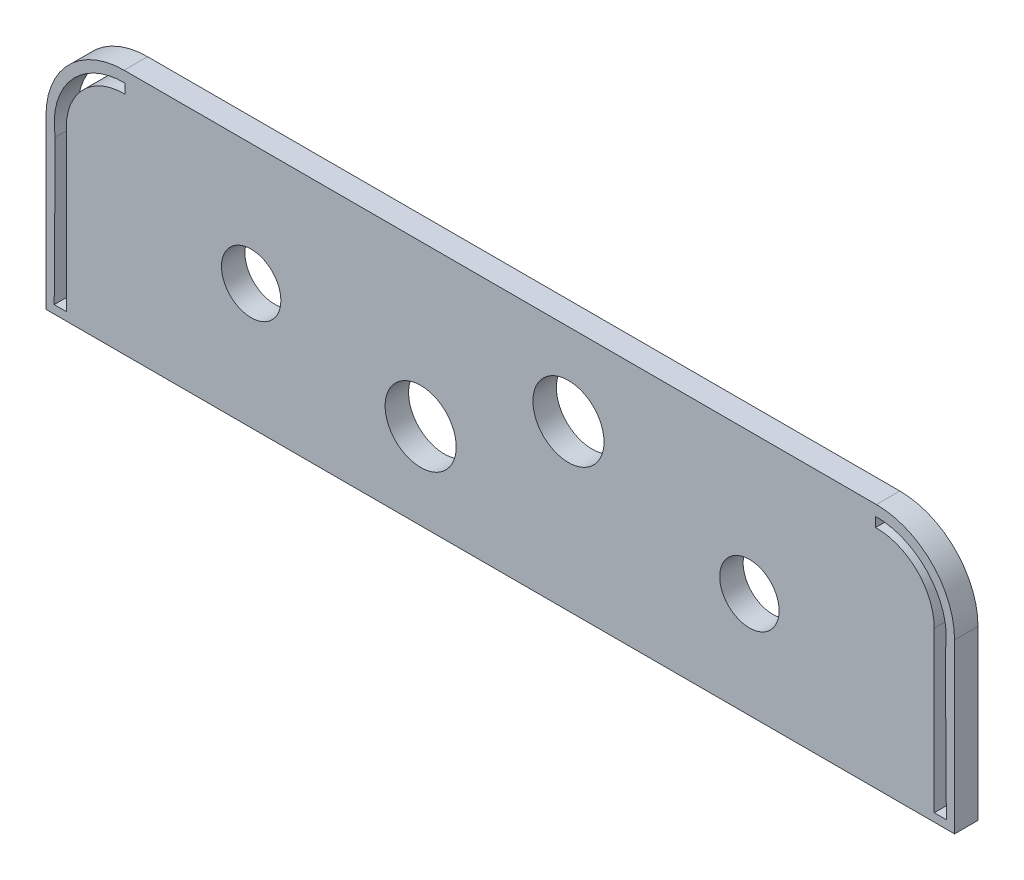
ISO-10303-21;
HEADER;
FILE_DESCRIPTION(('STEP AP214'),'2;1');
FILE_NAME('part.step','',(''),(''),'','','');
FILE_SCHEMA(('AUTOMOTIVE_DESIGN { 1 0 10303 214 1 1 1 1 }'));
ENDSEC;
DATA;
#1=APPLICATION_CONTEXT('core data for automotive mechanical design processes');
#2=APPLICATION_PROTOCOL_DEFINITION('international standard','automotive_design',2000,#1);
#3=PRODUCT_CONTEXT('',#1,'mechanical');
#4=PRODUCT('Part','Part','',(#3));
#5=PRODUCT_RELATED_PRODUCT_CATEGORY('part','',(#4));
#6=PRODUCT_DEFINITION_FORMATION('','',#4);
#7=PRODUCT_DEFINITION_CONTEXT('part definition',#1,'design');
#8=PRODUCT_DEFINITION('design','',#6,#7);
#9=PRODUCT_DEFINITION_SHAPE('','',#8);
#10=(LENGTH_UNIT() NAMED_UNIT(*) SI_UNIT(.MILLI.,.METRE.));
#11=(NAMED_UNIT(*) PLANE_ANGLE_UNIT() SI_UNIT($,.RADIAN.));
#12=(NAMED_UNIT(*) SI_UNIT($,.STERADIAN.) SOLID_ANGLE_UNIT());
#13=UNCERTAINTY_MEASURE_WITH_UNIT(LENGTH_MEASURE(1.E-05),#10,'distance_accuracy_value','');
#14=(GEOMETRIC_REPRESENTATION_CONTEXT(3) GLOBAL_UNCERTAINTY_ASSIGNED_CONTEXT((#13)) GLOBAL_UNIT_ASSIGNED_CONTEXT((#10,
#11,#12)) REPRESENTATION_CONTEXT('',''));
#15=CARTESIAN_POINT('',(0.,0.,0.));
#16=DIRECTION('',(0.,0.,1.));
#17=DIRECTION('',(1.,0.,0.));
#18=AXIS2_PLACEMENT_3D('',#15,#16,#17);
#19=CARTESIAN_POINT('',(58.125,5.75,3.));
#20=DIRECTION('',(-1.,0.,0.));
#21=DIRECTION('',(0.,-1.,0.));
#22=AXIS2_PLACEMENT_3D('',#19,#20,#21);
#23=PLANE('',#22);
#24=DIRECTION('',(0.,-1.,0.));
#25=VECTOR('',#24,1.);
#26=CARTESIAN_POINT('',(58.125,-15.75,3.));
#27=LINE('',#26,#25);
#28=CARTESIAN_POINT('',(58.125,5.74999999999999,3.));
#29=VERTEX_POINT('',#28);
#30=CARTESIAN_POINT('',(58.125,-15.75,3.));
#31=VERTEX_POINT('',#30);
#32=EDGE_CURVE('E367',#29,#31,#27,.T.);
#33=ORIENTED_EDGE('',*,*,#32,.T.);
#34=DIRECTION('',(0.,0.,-1.));
#35=VECTOR('',#34,1.);
#36=CARTESIAN_POINT('',(58.125,-15.75,3.));
#37=LINE('',#36,#35);
#38=CARTESIAN_POINT('',(58.125,-15.75,0.));
#39=VERTEX_POINT('',#38);
#40=EDGE_CURVE('E267',#31,#39,#37,.T.);
#41=ORIENTED_EDGE('',*,*,#40,.T.);
#42=DIRECTION('',(0.,1.,0.));
#43=VECTOR('',#42,1.);
#44=CARTESIAN_POINT('',(58.125,5.75,0.));
#45=LINE('',#44,#43);
#46=CARTESIAN_POINT('',(58.125,5.75,0.));
#47=VERTEX_POINT('',#46);
#48=EDGE_CURVE('E258',#39,#47,#45,.T.);
#49=ORIENTED_EDGE('',*,*,#48,.T.);
#50=DIRECTION('',(0.,0.,-1.));
#51=VECTOR('',#50,1.);
#52=CARTESIAN_POINT('',(58.125,5.75,3.));
#53=LINE('',#52,#51);
#54=EDGE_CURVE('E293',#29,#47,#53,.T.);
#55=ORIENTED_EDGE('',*,*,#54,.F.);
#56=EDGE_LOOP('',(#33,#41,#49,#55));
#57=FACE_BOUND('',#56,.T.);
#58=ADVANCED_FACE('F43',(#57),#23,.F.);
#59=CARTESIAN_POINT('',(48.125,5.75,3.));
#60=DIRECTION('',(0.,0.,-1.));
#61=DIRECTION('',(-1.,0.,0.));
#62=AXIS2_PLACEMENT_3D('',#59,#60,#61);
#63=CYLINDRICAL_SURFACE('',#62,10.);
#64=CARTESIAN_POINT('',(48.125,5.75,3.));
#65=DIRECTION('',(0.,0.,1.));
#66=DIRECTION('',(1.,0.,0.));
#67=AXIS2_PLACEMENT_3D('',#64,#65,#66);
#68=CIRCLE('',#67,10.);
#69=CARTESIAN_POINT('',(48.125,15.75,3.));
#70=VERTEX_POINT('',#69);
#71=EDGE_CURVE('E189',#70,#29,#68,.F.);
#72=ORIENTED_EDGE('',*,*,#71,.T.);
#73=ORIENTED_EDGE('',*,*,#54,.T.);
#74=CARTESIAN_POINT('',(48.125,5.75,0.));
#75=DIRECTION('',(0.,0.,1.));
#76=DIRECTION('',(-1.,0.,0.));
#77=AXIS2_PLACEMENT_3D('',#74,#75,#76);
#78=CIRCLE('',#77,10.);
#79=CARTESIAN_POINT('',(48.125,15.75,0.));
#80=VERTEX_POINT('',#79);
#81=EDGE_CURVE('E270',#47,#80,#78,.T.);
#82=ORIENTED_EDGE('',*,*,#81,.T.);
#83=DIRECTION('',(0.,0.,-1.));
#84=VECTOR('',#83,1.);
#85=CARTESIAN_POINT('',(48.125,15.75,3.));
#86=LINE('',#85,#84);
#87=EDGE_CURVE('E290',#70,#80,#86,.T.);
#88=ORIENTED_EDGE('',*,*,#87,.F.);
#89=EDGE_LOOP('',(#72,#73,#82,#88));
#90=FACE_BOUND('',#89,.T.);
#91=ADVANCED_FACE('F357',(#90),#63,.T.);
#92=CARTESIAN_POINT('',(-48.125,5.75,3.));
#93=DIRECTION('',(0.,0.,-1.));
#94=DIRECTION('',(-1.,0.,0.));
#95=AXIS2_PLACEMENT_3D('',#92,#93,#94);
#96=CYLINDRICAL_SURFACE('',#95,10.);
#97=CARTESIAN_POINT('',(-48.125,5.75,3.));
#98=DIRECTION('',(0.,0.,1.));
#99=DIRECTION('',(1.,0.,0.));
#100=AXIS2_PLACEMENT_3D('',#97,#98,#99);
#101=CIRCLE('',#100,10.);
#102=CARTESIAN_POINT('',(-58.125,5.75,3.));
#103=VERTEX_POINT('',#102);
#104=CARTESIAN_POINT('',(-48.125,15.75,3.));
#105=VERTEX_POINT('',#104);
#106=EDGE_CURVE('E319',#103,#105,#101,.F.);
#107=ORIENTED_EDGE('',*,*,#106,.T.);
#108=DIRECTION('',(0.,0.,-1.));
#109=VECTOR('',#108,1.);
#110=CARTESIAN_POINT('',(-48.125,15.75,3.));
#111=LINE('',#110,#109);
#112=CARTESIAN_POINT('',(-48.125,15.75,0.));
#113=VERTEX_POINT('',#112);
#114=EDGE_CURVE('E287',#105,#113,#111,.T.);
#115=ORIENTED_EDGE('',*,*,#114,.T.);
#116=CARTESIAN_POINT('',(-48.125,5.75,0.));
#117=DIRECTION('',(0.,0.,1.));
#118=DIRECTION('',(1.,0.,0.));
#119=AXIS2_PLACEMENT_3D('',#116,#117,#118);
#120=CIRCLE('',#119,10.);
#121=CARTESIAN_POINT('',(-58.125,5.75,0.));
#122=VERTEX_POINT('',#121);
#123=EDGE_CURVE('E274',#113,#122,#120,.T.);
#124=ORIENTED_EDGE('',*,*,#123,.T.);
#125=DIRECTION('',(0.,0.,-1.));
#126=VECTOR('',#125,1.);
#127=CARTESIAN_POINT('',(-58.125,5.75,3.));
#128=LINE('',#127,#126);
#129=EDGE_CURVE('E285',#103,#122,#128,.T.);
#130=ORIENTED_EDGE('',*,*,#129,.F.);
#131=EDGE_LOOP('',(#107,#115,#124,#130));
#132=FACE_BOUND('',#131,.T.);
#133=ADVANCED_FACE('F363',(#132),#96,.T.);
#134=CARTESIAN_POINT('',(-58.125,5.75,3.));
#135=DIRECTION('',(1.,0.,0.));
#136=DIRECTION('',(0.,0.,-1.));
#137=AXIS2_PLACEMENT_3D('',#134,#135,#136);
#138=PLANE('',#137);
#139=DIRECTION('',(0.,1.,0.));
#140=VECTOR('',#139,1.);
#141=CARTESIAN_POINT('',(-58.125,5.75,3.));
#142=LINE('',#141,#140);
#143=CARTESIAN_POINT('',(-58.125,-15.75,3.));
#144=VERTEX_POINT('',#143);
#145=EDGE_CURVE('E393',#144,#103,#142,.T.);
#146=ORIENTED_EDGE('',*,*,#145,.T.);
#147=ORIENTED_EDGE('',*,*,#129,.T.);
#148=DIRECTION('',(0.,-1.,0.));
#149=VECTOR('',#148,1.);
#150=CARTESIAN_POINT('',(-58.125,5.75,0.));
#151=LINE('',#150,#149);
#152=CARTESIAN_POINT('',(-58.125,-15.75,0.));
#153=VERTEX_POINT('',#152);
#154=EDGE_CURVE('E277',#122,#153,#151,.T.);
#155=ORIENTED_EDGE('',*,*,#154,.T.);
#156=DIRECTION('',(0.,0.,-1.));
#157=VECTOR('',#156,1.);
#158=CARTESIAN_POINT('',(-58.125,-15.75,3.));
#159=LINE('',#158,#157);
#160=EDGE_CURVE('E283',#144,#153,#159,.T.);
#161=ORIENTED_EDGE('',*,*,#160,.F.);
#162=EDGE_LOOP('',(#146,#147,#155,#161));
#163=FACE_BOUND('',#162,.T.);
#164=ADVANCED_FACE('F397',(#163),#138,.F.);
#165=CARTESIAN_POINT('',(-58.125,-15.75,3.));
#166=DIRECTION('',(0.,1.,0.));
#167=DIRECTION('',(0.,0.,1.));
#168=AXIS2_PLACEMENT_3D('',#165,#166,#167);
#169=PLANE('',#168);
#170=ORIENTED_EDGE('',*,*,#40,.F.);
#171=DIRECTION('',(1.,0.,0.));
#172=VECTOR('',#171,1.);
#173=CARTESIAN_POINT('',(-58.125,-15.75,3.));
#174=LINE('',#173,#172);
#175=EDGE_CURVE('E264',#144,#31,#174,.T.);
#176=ORIENTED_EDGE('',*,*,#175,.F.);
#177=ORIENTED_EDGE('',*,*,#160,.T.);
#178=DIRECTION('',(1.,0.,0.));
#179=VECTOR('',#178,1.);
#180=CARTESIAN_POINT('',(-58.125,-15.75,0.));
#181=LINE('',#180,#179);
#182=EDGE_CURVE('E265',#153,#39,#181,.T.);
#183=ORIENTED_EDGE('',*,*,#182,.T.);
#184=EDGE_LOOP('',(#170,#176,#177,#183));
#185=FACE_BOUND('',#184,.T.);
#186=ADVANCED_FACE('F372',(#185),#169,.F.);
#187=CARTESIAN_POINT('',(-48.125,5.4351898188413,-22.));
#188=DIRECTION('',(0.,0.,1.));
#189=DIRECTION('',(1.,0.,0.));
#190=AXIS2_PLACEMENT_3D('',#187,#188,#189);
#191=CYLINDRICAL_SURFACE('',#190,8.95);
#192=CARTESIAN_POINT('',(-48.125,5.4351898188413,3.));
#193=DIRECTION('',(0.,0.,1.));
#194=DIRECTION('',(1.,0.,0.));
#195=AXIS2_PLACEMENT_3D('',#192,#193,#194);
#196=CIRCLE('',#195,8.95);
#197=CARTESIAN_POINT('',(-48.025,14.3846311421866,3.));
#198=VERTEX_POINT('',#197);
#199=CARTESIAN_POINT('',(-56.946937757455,3.92657648084162,3.));
#200=VERTEX_POINT('',#199);
#201=EDGE_CURVE('E226',#198,#200,#196,.T.);
#202=ORIENTED_EDGE('',*,*,#201,.T.);
#203=DIRECTION('',(0.,0.,1.));
#204=VECTOR('',#203,1.);
#205=CARTESIAN_POINT('',(-56.946937757455,3.92657648084162,-22.));
#206=LINE('',#205,#204);
#207=CARTESIAN_POINT('',(-56.946937757455,3.92657648084162,0.));
#208=VERTEX_POINT('',#207);
#209=EDGE_CURVE('E195',#208,#200,#206,.T.);
#210=ORIENTED_EDGE('',*,*,#209,.F.);
#211=CARTESIAN_POINT('',(-48.125,5.4351898188413,0.));
#212=DIRECTION('',(0.,0.,1.));
#213=DIRECTION('',(1.,0.,0.));
#214=AXIS2_PLACEMENT_3D('',#211,#212,#213);
#215=CIRCLE('',#214,8.95);
#216=CARTESIAN_POINT('',(-48.025,14.3846311421866,0.));
#217=VERTEX_POINT('',#216);
#218=EDGE_CURVE('E228',#217,#208,#215,.T.);
#219=ORIENTED_EDGE('',*,*,#218,.F.);
#220=DIRECTION('',(0.,0.,1.));
#221=VECTOR('',#220,1.);
#222=CARTESIAN_POINT('',(-48.025,14.3846311421866,-22.));
#223=LINE('',#222,#221);
#224=EDGE_CURVE('E215',#217,#198,#223,.T.);
#225=ORIENTED_EDGE('',*,*,#224,.T.);
#226=EDGE_LOOP('',(#202,#210,#219,#225));
#227=FACE_BOUND('',#226,.T.);
#228=ADVANCED_FACE('F404',(#227),#191,.F.);
#229=CARTESIAN_POINT('',(-55.525,-14.7,-22.));
#230=DIRECTION('',(0.,-1.,0.));
#231=DIRECTION('',(0.,0.,-1.));
#232=AXIS2_PLACEMENT_3D('',#229,#230,#231);
#233=PLANE('',#232);
#234=DIRECTION('',(0.,0.,1.));
#235=VECTOR('',#234,1.);
#236=CARTESIAN_POINT('',(-57.0756936373201,-14.7,-22.));
#237=LINE('',#236,#235);
#238=CARTESIAN_POINT('',(-57.0756936373201,-14.7,0.));
#239=VERTEX_POINT('',#238);
#240=CARTESIAN_POINT('',(-57.0756936373201,-14.7,3.));
#241=VERTEX_POINT('',#240);
#242=EDGE_CURVE('E200',#239,#241,#237,.T.);
#243=ORIENTED_EDGE('',*,*,#242,.T.);
#244=DIRECTION('',(1.,0.,0.));
#245=VECTOR('',#244,1.);
#246=CARTESIAN_POINT('',(-48.125,-14.7,3.));
#247=LINE('',#246,#245);
#248=CARTESIAN_POINT('',(-55.525,-14.7,3.));
#249=VERTEX_POINT('',#248);
#250=EDGE_CURVE('E59',#241,#249,#247,.T.);
#251=ORIENTED_EDGE('',*,*,#250,.T.);
#252=DIRECTION('',(0.,0.,1.));
#253=VECTOR('',#252,1.);
#254=CARTESIAN_POINT('',(-55.525,-14.7,-22.));
#255=LINE('',#254,#253);
#256=CARTESIAN_POINT('',(-55.525,-14.7,0.));
#257=VERTEX_POINT('',#256);
#258=EDGE_CURVE('E206',#257,#249,#255,.T.);
#259=ORIENTED_EDGE('',*,*,#258,.F.);
#260=DIRECTION('',(1.,0.,0.));
#261=VECTOR('',#260,1.);
#262=CARTESIAN_POINT('',(-48.125,-14.7,0.));
#263=LINE('',#262,#261);
#264=EDGE_CURVE('E223',#239,#257,#263,.T.);
#265=ORIENTED_EDGE('',*,*,#264,.F.);
#266=EDGE_LOOP('',(#243,#251,#259,#265));
#267=FACE_BOUND('',#266,.T.);
#268=ADVANCED_FACE('F441',(#267),#233,.F.);
#269=CARTESIAN_POINT('',(-56.946937757455,3.92657648084162,-22.));
#270=DIRECTION('',(-0.999976109650513,0.00691231713860811,0.));
#271=DIRECTION('',(-0.00691231713860811,-0.999976109650513,0.));
#272=AXIS2_PLACEMENT_3D('',#269,#270,#271);
#273=PLANE('',#272);
#274=DIRECTION('',(-0.00691231713860811,-0.999976109650513,0.));
#275=VECTOR('',#274,1.);
#276=CARTESIAN_POINT('',(-57.0756936373201,-14.7,3.));
#277=LINE('',#276,#275);
#278=EDGE_CURVE('E392',#200,#241,#277,.T.);
#279=ORIENTED_EDGE('',*,*,#278,.T.);
#280=ORIENTED_EDGE('',*,*,#242,.F.);
#281=DIRECTION('',(-0.00691231713860811,-0.999976109650513,0.));
#282=VECTOR('',#281,1.);
#283=CARTESIAN_POINT('',(-56.9339124636112,5.81089145131277,0.));
#284=LINE('',#283,#282);
#285=EDGE_CURVE('E219',#208,#239,#284,.T.);
#286=ORIENTED_EDGE('',*,*,#285,.F.);
#287=ORIENTED_EDGE('',*,*,#209,.T.);
#288=EDGE_LOOP('',(#279,#280,#286,#287));
#289=FACE_BOUND('',#288,.T.);
#290=ADVANCED_FACE('F353',(#289),#273,.F.);
#291=CARTESIAN_POINT('',(55.525,-14.7,-22.));
#292=DIRECTION('',(0.,-1.,0.));
#293=DIRECTION('',(0.,0.,-1.));
#294=AXIS2_PLACEMENT_3D('',#291,#292,#293);
#295=PLANE('',#294);
#296=DIRECTION('',(1.,0.,0.));
#297=VECTOR('',#296,1.);
#298=CARTESIAN_POINT('',(-48.125,-14.7,3.));
#299=LINE('',#298,#297);
#300=CARTESIAN_POINT('',(55.525,-14.7,3.));
#301=VERTEX_POINT('',#300);
#302=CARTESIAN_POINT('',(57.0756936373201,-14.7,3.));
#303=VERTEX_POINT('',#302);
#304=EDGE_CURVE('E172',#301,#303,#299,.T.);
#305=ORIENTED_EDGE('',*,*,#304,.T.);
#306=DIRECTION('',(0.,0.,1.));
#307=VECTOR('',#306,1.);
#308=CARTESIAN_POINT('',(57.0756936373201,-14.7,-22.));
#309=LINE('',#308,#307);
#310=CARTESIAN_POINT('',(57.0756936373201,-14.7,0.));
#311=VERTEX_POINT('',#310);
#312=EDGE_CURVE('E175',#311,#303,#309,.T.);
#313=ORIENTED_EDGE('',*,*,#312,.F.);
#314=DIRECTION('',(1.,0.,0.));
#315=VECTOR('',#314,1.);
#316=CARTESIAN_POINT('',(-48.125,-14.7,0.));
#317=LINE('',#316,#315);
#318=CARTESIAN_POINT('',(55.525,-14.7,0.));
#319=VERTEX_POINT('',#318);
#320=EDGE_CURVE('E180',#319,#311,#317,.T.);
#321=ORIENTED_EDGE('',*,*,#320,.F.);
#322=DIRECTION('',(0.,0.,1.));
#323=VECTOR('',#322,1.);
#324=CARTESIAN_POINT('',(55.525,-14.7,-22.));
#325=LINE('',#324,#323);
#326=EDGE_CURVE('E178',#319,#301,#325,.T.);
#327=ORIENTED_EDGE('',*,*,#326,.T.);
#328=EDGE_LOOP('',(#305,#313,#321,#327));
#329=FACE_BOUND('',#328,.T.);
#330=ADVANCED_FACE('F173',(#329),#295,.F.);
#331=CARTESIAN_POINT('',(48.125,5.43518981884131,-22.));
#332=DIRECTION('',(0.,0.,1.));
#333=DIRECTION('',(1.,0.,0.));
#334=AXIS2_PLACEMENT_3D('',#331,#332,#333);
#335=CYLINDRICAL_SURFACE('',#334,8.95);
#336=DIRECTION('',(0.,0.,1.));
#337=VECTOR('',#336,1.);
#338=CARTESIAN_POINT('',(56.946937757455,3.92657648084163,-22.));
#339=LINE('',#338,#337);
#340=CARTESIAN_POINT('',(56.946937757455,3.92657648084163,0.));
#341=VERTEX_POINT('',#340);
#342=CARTESIAN_POINT('',(56.946937757455,3.92657648084163,3.));
#343=VERTEX_POINT('',#342);
#344=EDGE_CURVE('E194',#341,#343,#339,.T.);
#345=ORIENTED_EDGE('',*,*,#344,.T.);
#346=CARTESIAN_POINT('',(48.125,5.43518981884131,3.));
#347=DIRECTION('',(0.,0.,1.));
#348=DIRECTION('',(1.,0.,0.));
#349=AXIS2_PLACEMENT_3D('',#346,#347,#348);
#350=CIRCLE('',#349,8.95);
#351=CARTESIAN_POINT('',(48.025,14.3846311421866,3.));
#352=VERTEX_POINT('',#351);
#353=EDGE_CURVE('E67',#343,#352,#350,.T.);
#354=ORIENTED_EDGE('',*,*,#353,.T.);
#355=DIRECTION('',(0.,0.,1.));
#356=VECTOR('',#355,1.);
#357=CARTESIAN_POINT('',(48.025,14.3846311421866,-22.));
#358=LINE('',#357,#356);
#359=CARTESIAN_POINT('',(48.025,14.3846311421866,0.));
#360=VERTEX_POINT('',#359);
#361=EDGE_CURVE('E197',#360,#352,#358,.T.);
#362=ORIENTED_EDGE('',*,*,#361,.F.);
#363=CARTESIAN_POINT('',(48.125,5.43518981884131,0.));
#364=DIRECTION('',(0.,0.,1.));
#365=DIRECTION('',(1.,0.,0.));
#366=AXIS2_PLACEMENT_3D('',#363,#364,#365);
#367=CIRCLE('',#366,8.95);
#368=EDGE_CURVE('E181',#341,#360,#367,.T.);
#369=ORIENTED_EDGE('',*,*,#368,.F.);
#370=EDGE_LOOP('',(#345,#354,#362,#369));
#371=FACE_BOUND('',#370,.T.);
#372=ADVANCED_FACE('F345',(#371),#335,.F.);
#373=CARTESIAN_POINT('',(56.946937757455,3.92657648084163,-22.));
#374=DIRECTION('',(0.999976109650513,0.00691231713860886,0.));
#375=DIRECTION('',(-0.00691231713860886,0.999976109650513,0.));
#376=AXIS2_PLACEMENT_3D('',#373,#374,#375);
#377=PLANE('',#376);
#378=DIRECTION('',(-0.00691231713860923,0.999976109650513,0.));
#379=VECTOR('',#378,1.);
#380=CARTESIAN_POINT('',(56.946937757455,3.92657648084163,3.));
#381=LINE('',#380,#379);
#382=EDGE_CURVE('E183',#303,#343,#381,.T.);
#383=ORIENTED_EDGE('',*,*,#382,.T.);
#384=ORIENTED_EDGE('',*,*,#344,.F.);
#385=DIRECTION('',(-0.00691231713860886,0.999976109650513,0.));
#386=VECTOR('',#385,1.);
#387=CARTESIAN_POINT('',(56.9293136262696,6.47618608140293,0.));
#388=LINE('',#387,#386);
#389=EDGE_CURVE('E193',#311,#341,#388,.T.);
#390=ORIENTED_EDGE('',*,*,#389,.F.);
#391=ORIENTED_EDGE('',*,*,#312,.T.);
#392=EDGE_LOOP('',(#383,#384,#390,#391));
#393=FACE_BOUND('',#392,.T.);
#394=ADVANCED_FACE('F191',(#393),#377,.F.);
#395=CARTESIAN_POINT('',(-48.125,5.75,3.));
#396=DIRECTION('',(0.,0.,1.));
#397=DIRECTION('',(1.,0.,0.));
#398=AXIS2_PLACEMENT_3D('',#395,#396,#397);
#399=PLANE('',#398);
#400=ORIENTED_EDGE('',*,*,#382,.F.);
#401=ORIENTED_EDGE('',*,*,#304,.F.);
#402=DIRECTION('',(0.,-1.,0.));
#403=VECTOR('',#402,1.);
#404=CARTESIAN_POINT('',(55.525,5.75,3.));
#405=LINE('',#404,#403);
#406=CARTESIAN_POINT('',(55.525,5.75000000000001,3.));
#407=VERTEX_POINT('',#406);
#408=EDGE_CURVE('E246',#407,#301,#405,.T.);
#409=ORIENTED_EDGE('',*,*,#408,.F.);
#410=CARTESIAN_POINT('',(48.125,5.75000000000001,3.));
#411=DIRECTION('',(0.,0.,1.));
#412=DIRECTION('',(1.,0.,0.));
#413=AXIS2_PLACEMENT_3D('',#410,#411,#412);
#414=CIRCLE('',#413,7.40000000000001);
#415=CARTESIAN_POINT('',(48.025,13.1493242934744,3.));
#416=VERTEX_POINT('',#415);
#417=EDGE_CURVE('E244',#416,#407,#414,.F.);
#418=ORIENTED_EDGE('',*,*,#417,.F.);
#419=DIRECTION('',(0.,-1.,0.));
#420=VECTOR('',#419,1.);
#421=CARTESIAN_POINT('',(48.025,5.75,3.));
#422=LINE('',#421,#420);
#423=EDGE_CURVE('E242',#352,#416,#422,.T.);
#424=ORIENTED_EDGE('',*,*,#423,.F.);
#425=ORIENTED_EDGE('',*,*,#353,.F.);
#426=EDGE_LOOP('',(#400,#401,#409,#418,#424,#425));
#427=FACE_BOUND('',#426,.T.);
#428=DIRECTION('',(-1.,0.,0.));
#429=VECTOR('',#428,1.);
#430=CARTESIAN_POINT('',(-48.125,15.75,3.));
#431=LINE('',#430,#429);
#432=EDGE_CURVE('E261',#70,#105,#431,.T.);
#433=ORIENTED_EDGE('',*,*,#432,.T.);
#434=ORIENTED_EDGE('',*,*,#106,.F.);
#435=ORIENTED_EDGE('',*,*,#145,.F.);
#436=ORIENTED_EDGE('',*,*,#175,.T.);
#437=ORIENTED_EDGE('',*,*,#32,.F.);
#438=ORIENTED_EDGE('',*,*,#71,.F.);
#439=EDGE_LOOP('',(#433,#434,#435,#436,#437,#438));
#440=FACE_BOUND('',#439,.T.);
#441=CARTESIAN_POINT('',(-10.185,-4.75,3.));
#442=DIRECTION('',(0.,0.,1.));
#443=DIRECTION('',(1.,0.,0.));
#444=AXIS2_PLACEMENT_3D('',#441,#442,#443);
#445=CIRCLE('',#444,4.55);
#446=CARTESIAN_POINT('',(-5.635,-4.75,3.));
#447=VERTEX_POINT('',#446);
#448=EDGE_CURVE('E218',#447,#447,#445,.T.);
#449=ORIENTED_EDGE('',*,*,#448,.F.);
#450=EDGE_LOOP('',(#449));
#451=FACE_BOUND('',#450,.T.);
#452=CARTESIAN_POINT('',(8.72499999999998,5.25,3.));
#453=DIRECTION('',(0.,0.,1.));
#454=DIRECTION('',(1.,0.,0.));
#455=AXIS2_PLACEMENT_3D('',#452,#453,#454);
#456=CIRCLE('',#455,4.54999999999999);
#457=CARTESIAN_POINT('',(13.275,5.25,3.));
#458=VERTEX_POINT('',#457);
#459=EDGE_CURVE('E309',#458,#458,#456,.T.);
#460=ORIENTED_EDGE('',*,*,#459,.F.);
#461=EDGE_LOOP('',(#460));
#462=FACE_BOUND('',#461,.T.);
#463=ORIENTED_EDGE('',*,*,#278,.F.);
#464=ORIENTED_EDGE('',*,*,#201,.F.);
#465=DIRECTION('',(0.,1.,0.));
#466=VECTOR('',#465,1.);
#467=CARTESIAN_POINT('',(-48.025,5.75,3.));
#468=LINE('',#467,#466);
#469=CARTESIAN_POINT('',(-48.025,13.1493242934744,3.));
#470=VERTEX_POINT('',#469);
#471=EDGE_CURVE('E240',#470,#198,#468,.T.);
#472=ORIENTED_EDGE('',*,*,#471,.F.);
#473=CARTESIAN_POINT('',(-48.125,5.75,3.));
#474=DIRECTION('',(0.,0.,1.));
#475=DIRECTION('',(1.,0.,0.));
#476=AXIS2_PLACEMENT_3D('',#473,#474,#475);
#477=CIRCLE('',#476,7.4);
#478=CARTESIAN_POINT('',(-55.525,5.75,3.));
#479=VERTEX_POINT('',#478);
#480=EDGE_CURVE('E238',#479,#470,#477,.F.);
#481=ORIENTED_EDGE('',*,*,#480,.F.);
#482=DIRECTION('',(0.,1.,0.));
#483=VECTOR('',#482,1.);
#484=CARTESIAN_POINT('',(-55.525,5.75,3.));
#485=LINE('',#484,#483);
#486=EDGE_CURVE('E236',#249,#479,#485,.T.);
#487=ORIENTED_EDGE('',*,*,#486,.F.);
#488=ORIENTED_EDGE('',*,*,#250,.F.);
#489=EDGE_LOOP('',(#463,#464,#472,#481,#487,#488));
#490=FACE_BOUND('',#489,.T.);
#491=CARTESIAN_POINT('',(31.875,-2.25,3.));
#492=DIRECTION('',(0.,0.,1.));
#493=DIRECTION('',(1.,0.,0.));
#494=AXIS2_PLACEMENT_3D('',#491,#492,#493);
#495=CIRCLE('',#494,3.8);
#496=CARTESIAN_POINT('',(35.675,-2.25,3.));
#497=VERTEX_POINT('',#496);
#498=EDGE_CURVE('E255',#497,#497,#495,.T.);
#499=ORIENTED_EDGE('',*,*,#498,.F.);
#500=EDGE_LOOP('',(#499));
#501=FACE_BOUND('',#500,.T.);
#502=CARTESIAN_POINT('',(-31.875,0.249999999999998,3.));
#503=DIRECTION('',(0.,0.,1.));
#504=DIRECTION('',(1.,0.,0.));
#505=AXIS2_PLACEMENT_3D('',#502,#503,#504);
#506=CIRCLE('',#505,3.8);
#507=CARTESIAN_POINT('',(-28.075,0.249999999999998,3.));
#508=VERTEX_POINT('',#507);
#509=EDGE_CURVE('E249',#508,#508,#506,.T.);
#510=ORIENTED_EDGE('',*,*,#509,.F.);
#511=EDGE_LOOP('',(#510));
#512=FACE_BOUND('',#511,.T.);
#513=ADVANCED_FACE('F184',(#427,#440,#451,#462,#490,#501,#512),#399,.T.);
#514=CARTESIAN_POINT('',(-48.125,5.75,0.));
#515=DIRECTION('',(0.,0.,1.));
#516=DIRECTION('',(1.,0.,0.));
#517=AXIS2_PLACEMENT_3D('',#514,#515,#516);
#518=PLANE('',#517);
#519=CARTESIAN_POINT('',(-10.185,-4.75,0.));
#520=DIRECTION('',(0.,0.,1.));
#521=DIRECTION('',(1.,0.,0.));
#522=AXIS2_PLACEMENT_3D('',#519,#520,#521);
#523=CIRCLE('',#522,4.55);
#524=CARTESIAN_POINT('',(-5.635,-4.75,0.));
#525=VERTEX_POINT('',#524);
#526=EDGE_CURVE('E46',#525,#525,#523,.T.);
#527=ORIENTED_EDGE('',*,*,#526,.T.);
#528=EDGE_LOOP('',(#527));
#529=FACE_BOUND('',#528,.T.);
#530=CARTESIAN_POINT('',(8.72499999999998,5.25,0.));
#531=DIRECTION('',(0.,0.,1.));
#532=DIRECTION('',(1.,0.,0.));
#533=AXIS2_PLACEMENT_3D('',#530,#531,#532);
#534=CIRCLE('',#533,4.54999999999999);
#535=CARTESIAN_POINT('',(13.275,5.25,0.));
#536=VERTEX_POINT('',#535);
#537=EDGE_CURVE('E188',#536,#536,#534,.T.);
#538=ORIENTED_EDGE('',*,*,#537,.T.);
#539=EDGE_LOOP('',(#538));
#540=FACE_BOUND('',#539,.T.);
#541=DIRECTION('',(0.,-1.,0.));
#542=VECTOR('',#541,1.);
#543=CARTESIAN_POINT('',(55.525,5.75,0.));
#544=LINE('',#543,#542);
#545=CARTESIAN_POINT('',(55.525,5.75000000000001,0.));
#546=VERTEX_POINT('',#545);
#547=EDGE_CURVE('E11',#546,#319,#544,.T.);
#548=ORIENTED_EDGE('',*,*,#547,.T.);
#549=ORIENTED_EDGE('',*,*,#320,.T.);
#550=ORIENTED_EDGE('',*,*,#389,.T.);
#551=ORIENTED_EDGE('',*,*,#368,.T.);
#552=DIRECTION('',(0.,-1.,0.));
#553=VECTOR('',#552,1.);
#554=CARTESIAN_POINT('',(48.025,5.75,0.));
#555=LINE('',#554,#553);
#556=CARTESIAN_POINT('',(48.025,13.1493242934744,0.));
#557=VERTEX_POINT('',#556);
#558=EDGE_CURVE('E304',#360,#557,#555,.T.);
#559=ORIENTED_EDGE('',*,*,#558,.T.);
#560=CARTESIAN_POINT('',(48.125,5.75000000000001,0.));
#561=DIRECTION('',(0.,0.,1.));
#562=DIRECTION('',(1.,0.,0.));
#563=AXIS2_PLACEMENT_3D('',#560,#561,#562);
#564=CIRCLE('',#563,7.40000000000001);
#565=EDGE_CURVE('E51',#557,#546,#564,.F.);
#566=ORIENTED_EDGE('',*,*,#565,.T.);
#567=EDGE_LOOP('',(#548,#549,#550,#551,#559,#566));
#568=FACE_BOUND('',#567,.T.);
#569=DIRECTION('',(0.,1.,0.));
#570=VECTOR('',#569,1.);
#571=CARTESIAN_POINT('',(-48.025,5.75,0.));
#572=LINE('',#571,#570);
#573=CARTESIAN_POINT('',(-48.025,13.1493242934744,0.));
#574=VERTEX_POINT('',#573);
#575=EDGE_CURVE('E301',#574,#217,#572,.T.);
#576=ORIENTED_EDGE('',*,*,#575,.T.);
#577=ORIENTED_EDGE('',*,*,#218,.T.);
#578=ORIENTED_EDGE('',*,*,#285,.T.);
#579=ORIENTED_EDGE('',*,*,#264,.T.);
#580=DIRECTION('',(0.,1.,0.));
#581=VECTOR('',#580,1.);
#582=CARTESIAN_POINT('',(-55.525,5.75,0.));
#583=LINE('',#582,#581);
#584=CARTESIAN_POINT('',(-55.525,5.75,0.));
#585=VERTEX_POINT('',#584);
#586=EDGE_CURVE('E295',#257,#585,#583,.T.);
#587=ORIENTED_EDGE('',*,*,#586,.T.);
#588=CARTESIAN_POINT('',(-48.125,5.75,0.));
#589=DIRECTION('',(0.,0.,1.));
#590=DIRECTION('',(1.,0.,0.));
#591=AXIS2_PLACEMENT_3D('',#588,#589,#590);
#592=CIRCLE('',#591,7.4);
#593=EDGE_CURVE('E298',#585,#574,#592,.F.);
#594=ORIENTED_EDGE('',*,*,#593,.T.);
#595=EDGE_LOOP('',(#576,#577,#578,#579,#587,#594));
#596=FACE_BOUND('',#595,.T.);
#597=ORIENTED_EDGE('',*,*,#48,.F.);
#598=ORIENTED_EDGE('',*,*,#182,.F.);
#599=ORIENTED_EDGE('',*,*,#154,.F.);
#600=ORIENTED_EDGE('',*,*,#123,.F.);
#601=DIRECTION('',(-1.,0.,0.));
#602=VECTOR('',#601,1.);
#603=CARTESIAN_POINT('',(-48.125,15.75,0.));
#604=LINE('',#603,#602);
#605=EDGE_CURVE('E272',#80,#113,#604,.T.);
#606=ORIENTED_EDGE('',*,*,#605,.F.);
#607=ORIENTED_EDGE('',*,*,#81,.F.);
#608=EDGE_LOOP('',(#597,#598,#599,#600,#606,#607));
#609=FACE_BOUND('',#608,.T.);
#610=CARTESIAN_POINT('',(31.875,-2.25,0.));
#611=DIRECTION('',(0.,0.,1.));
#612=DIRECTION('',(1.,0.,0.));
#613=AXIS2_PLACEMENT_3D('',#610,#611,#612);
#614=CIRCLE('',#613,3.8);
#615=CARTESIAN_POINT('',(35.675,-2.25,0.));
#616=VERTEX_POINT('',#615);
#617=EDGE_CURVE('E252',#616,#616,#614,.T.);
#618=ORIENTED_EDGE('',*,*,#617,.T.);
#619=EDGE_LOOP('',(#618));
#620=FACE_BOUND('',#619,.T.);
#621=CARTESIAN_POINT('',(-31.875,0.249999999999998,0.));
#622=DIRECTION('',(0.,0.,1.));
#623=DIRECTION('',(1.,0.,0.));
#624=AXIS2_PLACEMENT_3D('',#621,#622,#623);
#625=CIRCLE('',#624,3.8);
#626=CARTESIAN_POINT('',(-28.075,0.249999999999998,0.));
#627=VERTEX_POINT('',#626);
#628=EDGE_CURVE('E248',#627,#627,#625,.T.);
#629=ORIENTED_EDGE('',*,*,#628,.T.);
#630=EDGE_LOOP('',(#629));
#631=FACE_BOUND('',#630,.T.);
#632=ADVANCED_FACE('F343',(#529,#540,#568,#596,#609,#620,#631),#518,.F.);
#633=CARTESIAN_POINT('',(-48.125,15.75,3.));
#634=DIRECTION('',(0.,-1.,0.));
#635=DIRECTION('',(1.,0.,0.));
#636=AXIS2_PLACEMENT_3D('',#633,#634,#635);
#637=PLANE('',#636);
#638=ORIENTED_EDGE('',*,*,#605,.T.);
#639=ORIENTED_EDGE('',*,*,#114,.F.);
#640=ORIENTED_EDGE('',*,*,#432,.F.);
#641=ORIENTED_EDGE('',*,*,#87,.T.);
#642=EDGE_LOOP('',(#638,#639,#640,#641));
#643=FACE_BOUND('',#642,.T.);
#644=ADVANCED_FACE('F386',(#643),#637,.F.);
#645=CARTESIAN_POINT('',(31.875,-2.25,3.));
#646=DIRECTION('',(0.,0.,-1.));
#647=DIRECTION('',(-1.,0.,0.));
#648=AXIS2_PLACEMENT_3D('',#645,#646,#647);
#649=CYLINDRICAL_SURFACE('',#648,3.8);
#650=ORIENTED_EDGE('',*,*,#498,.T.);
#651=EDGE_LOOP('',(#650));
#652=FACE_BOUND('',#651,.T.);
#653=ORIENTED_EDGE('',*,*,#617,.F.);
#654=EDGE_LOOP('',(#653));
#655=FACE_BOUND('',#654,.T.);
#656=ADVANCED_FACE('F410',(#652,#655),#649,.F.);
#657=CARTESIAN_POINT('',(-31.875,0.249999999999998,3.));
#658=DIRECTION('',(0.,0.,-1.));
#659=DIRECTION('',(-1.,0.,0.));
#660=AXIS2_PLACEMENT_3D('',#657,#658,#659);
#661=CYLINDRICAL_SURFACE('',#660,3.8);
#662=ORIENTED_EDGE('',*,*,#509,.T.);
#663=EDGE_LOOP('',(#662));
#664=FACE_BOUND('',#663,.T.);
#665=ORIENTED_EDGE('',*,*,#628,.F.);
#666=EDGE_LOOP('',(#665));
#667=FACE_BOUND('',#666,.T.);
#668=ADVANCED_FACE('F415',(#664,#667),#661,.F.);
#669=CARTESIAN_POINT('',(-48.025,13.1493242934744,-22.));
#670=DIRECTION('',(1.,0.,0.));
#671=DIRECTION('',(0.,0.,-1.));
#672=AXIS2_PLACEMENT_3D('',#669,#670,#671);
#673=PLANE('',#672);
#674=ORIENTED_EDGE('',*,*,#471,.T.);
#675=ORIENTED_EDGE('',*,*,#224,.F.);
#676=ORIENTED_EDGE('',*,*,#575,.F.);
#677=DIRECTION('',(0.,0.,1.));
#678=VECTOR('',#677,1.);
#679=CARTESIAN_POINT('',(-48.025,13.1493242934744,-22.));
#680=LINE('',#679,#678);
#681=EDGE_CURVE('E212',#574,#470,#680,.T.);
#682=ORIENTED_EDGE('',*,*,#681,.T.);
#683=EDGE_LOOP('',(#674,#675,#676,#682));
#684=FACE_BOUND('',#683,.T.);
#685=ADVANCED_FACE('F428',(#684),#673,.F.);
#686=CARTESIAN_POINT('',(-48.125,5.75,-22.));
#687=DIRECTION('',(0.,0.,1.));
#688=DIRECTION('',(1.,0.,0.));
#689=AXIS2_PLACEMENT_3D('',#686,#687,#688);
#690=CYLINDRICAL_SURFACE('',#689,7.4);
#691=ORIENTED_EDGE('',*,*,#480,.T.);
#692=ORIENTED_EDGE('',*,*,#681,.F.);
#693=ORIENTED_EDGE('',*,*,#593,.F.);
#694=DIRECTION('',(0.,0.,1.));
#695=VECTOR('',#694,1.);
#696=CARTESIAN_POINT('',(-55.525,5.75,-22.));
#697=LINE('',#696,#695);
#698=EDGE_CURVE('E209',#585,#479,#697,.T.);
#699=ORIENTED_EDGE('',*,*,#698,.T.);
#700=EDGE_LOOP('',(#691,#692,#693,#699));
#701=FACE_BOUND('',#700,.T.);
#702=ADVANCED_FACE('F432',(#701),#690,.T.);
#703=CARTESIAN_POINT('',(-55.525,-14.7,-22.));
#704=DIRECTION('',(1.,0.,0.));
#705=DIRECTION('',(0.,0.,-1.));
#706=AXIS2_PLACEMENT_3D('',#703,#704,#705);
#707=PLANE('',#706);
#708=ORIENTED_EDGE('',*,*,#486,.T.);
#709=ORIENTED_EDGE('',*,*,#698,.F.);
#710=ORIENTED_EDGE('',*,*,#586,.F.);
#711=ORIENTED_EDGE('',*,*,#258,.T.);
#712=EDGE_LOOP('',(#708,#709,#710,#711));
#713=FACE_BOUND('',#712,.T.);
#714=ADVANCED_FACE('F436',(#713),#707,.F.);
#715=CARTESIAN_POINT('',(55.525,-14.7,-22.));
#716=DIRECTION('',(-1.,0.,0.));
#717=DIRECTION('',(0.,0.,1.));
#718=AXIS2_PLACEMENT_3D('',#715,#716,#717);
#719=PLANE('',#718);
#720=ORIENTED_EDGE('',*,*,#408,.T.);
#721=ORIENTED_EDGE('',*,*,#326,.F.);
#722=ORIENTED_EDGE('',*,*,#547,.F.);
#723=DIRECTION('',(0.,0.,1.));
#724=VECTOR('',#723,1.);
#725=CARTESIAN_POINT('',(55.525,5.75000000000001,-22.));
#726=LINE('',#725,#724);
#727=EDGE_CURVE('E324',#546,#407,#726,.T.);
#728=ORIENTED_EDGE('',*,*,#727,.T.);
#729=EDGE_LOOP('',(#720,#721,#722,#728));
#730=FACE_BOUND('',#729,.T.);
#731=ADVANCED_FACE('F341',(#730),#719,.F.);
#732=CARTESIAN_POINT('',(48.125,5.75000000000001,-22.));
#733=DIRECTION('',(0.,0.,1.));
#734=DIRECTION('',(1.,0.,0.));
#735=AXIS2_PLACEMENT_3D('',#732,#733,#734);
#736=CYLINDRICAL_SURFACE('',#735,7.40000000000001);
#737=ORIENTED_EDGE('',*,*,#417,.T.);
#738=ORIENTED_EDGE('',*,*,#727,.F.);
#739=ORIENTED_EDGE('',*,*,#565,.F.);
#740=DIRECTION('',(0.,0.,1.));
#741=VECTOR('',#740,1.);
#742=CARTESIAN_POINT('',(48.025,13.1493242934744,-22.));
#743=LINE('',#742,#741);
#744=EDGE_CURVE('E327',#557,#416,#743,.T.);
#745=ORIENTED_EDGE('',*,*,#744,.T.);
#746=EDGE_LOOP('',(#737,#738,#739,#745));
#747=FACE_BOUND('',#746,.T.);
#748=ADVANCED_FACE('F339',(#747),#736,.T.);
#749=CARTESIAN_POINT('',(48.025,13.1493242934744,-22.));
#750=DIRECTION('',(-1.,0.,0.));
#751=DIRECTION('',(0.,0.,1.));
#752=AXIS2_PLACEMENT_3D('',#749,#750,#751);
#753=PLANE('',#752);
#754=ORIENTED_EDGE('',*,*,#423,.T.);
#755=ORIENTED_EDGE('',*,*,#744,.F.);
#756=ORIENTED_EDGE('',*,*,#558,.F.);
#757=ORIENTED_EDGE('',*,*,#361,.T.);
#758=EDGE_LOOP('',(#754,#755,#756,#757));
#759=FACE_BOUND('',#758,.T.);
#760=ADVANCED_FACE('F332',(#759),#753,.F.);
#761=CARTESIAN_POINT('',(8.72499999999998,5.25,-23.));
#762=DIRECTION('',(0.,0.,1.));
#763=DIRECTION('',(1.,0.,0.));
#764=AXIS2_PLACEMENT_3D('',#761,#762,#763);
#765=CYLINDRICAL_SURFACE('',#764,4.54999999999999);
#766=ORIENTED_EDGE('',*,*,#459,.T.);
#767=EDGE_LOOP('',(#766));
#768=FACE_BOUND('',#767,.T.);
#769=ORIENTED_EDGE('',*,*,#537,.F.);
#770=EDGE_LOOP('',(#769));
#771=FACE_BOUND('',#770,.T.);
#772=ADVANCED_FACE('F504',(#768,#771),#765,.F.);
#773=CARTESIAN_POINT('',(-10.185,-4.75,-23.));
#774=DIRECTION('',(0.,0.,1.));
#775=DIRECTION('',(1.,0.,0.));
#776=AXIS2_PLACEMENT_3D('',#773,#774,#775);
#777=CYLINDRICAL_SURFACE('',#776,4.55);
#778=ORIENTED_EDGE('',*,*,#448,.T.);
#779=EDGE_LOOP('',(#778));
#780=FACE_BOUND('',#779,.T.);
#781=ORIENTED_EDGE('',*,*,#526,.F.);
#782=EDGE_LOOP('',(#781));
#783=FACE_BOUND('',#782,.T.);
#784=ADVANCED_FACE('F501',(#780,#783),#777,.F.);
#785=CLOSED_SHELL('',(#58,#91,#133,#164,#186,#228,#268,#290,#330,#372,#394,#513,#632,#644,#656,
#668,#685,#702,#714,#731,#748,#760,#772,#784));
#786=MANIFOLD_SOLID_BREP('B2',#785);
#787=ADVANCED_BREP_SHAPE_REPRESENTATION('',(#18,#786),#14);
#788=SHAPE_DEFINITION_REPRESENTATION(#9,#787);
ENDSEC;
END-ISO-10303-21;
